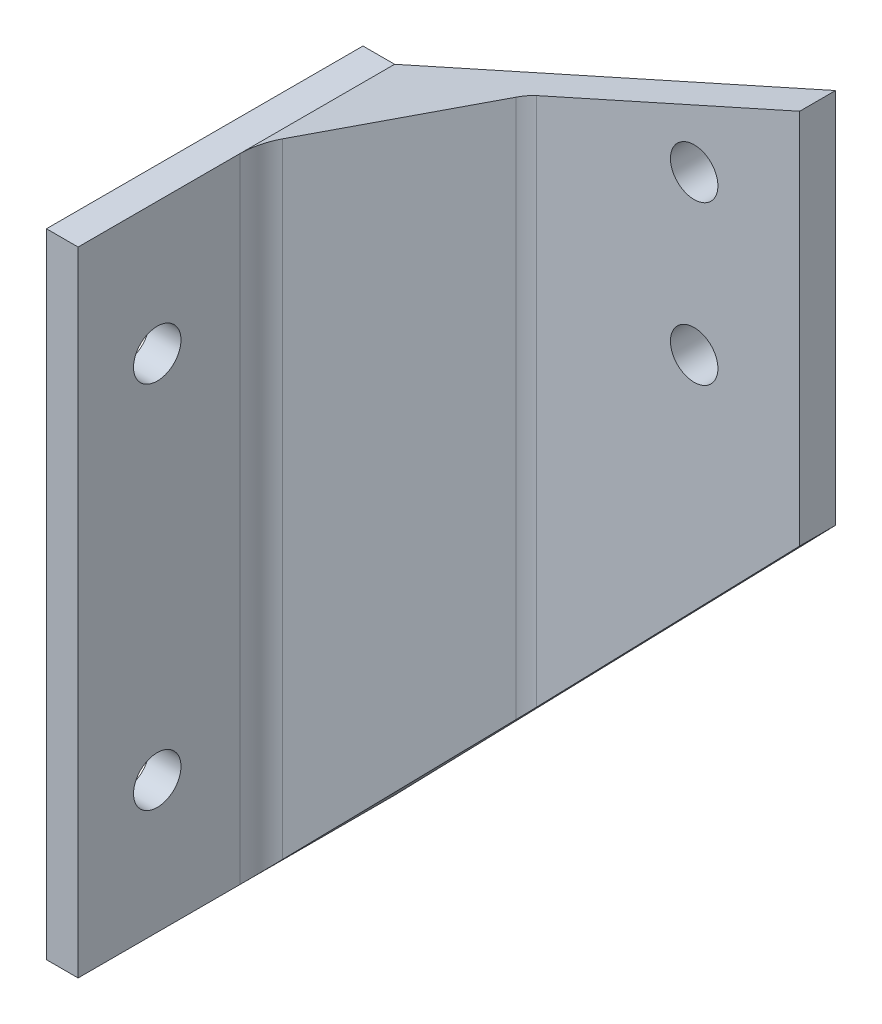
ISO-10303-21;
HEADER;
FILE_DESCRIPTION(('STEP AP214'),'2;1');
FILE_NAME('part.step','',(''),(''),'','','');
FILE_SCHEMA(('AUTOMOTIVE_DESIGN { 1 0 10303 214 1 1 1 1 }'));
ENDSEC;
DATA;
#1=APPLICATION_CONTEXT('core data for automotive mechanical design processes');
#2=APPLICATION_PROTOCOL_DEFINITION('international standard','automotive_design',2000,#1);
#3=PRODUCT_CONTEXT('',#1,'mechanical');
#4=PRODUCT('Part','Part','',(#3));
#5=PRODUCT_RELATED_PRODUCT_CATEGORY('part','',(#4));
#6=PRODUCT_DEFINITION_FORMATION('','',#4);
#7=PRODUCT_DEFINITION_CONTEXT('part definition',#1,'design');
#8=PRODUCT_DEFINITION('design','',#6,#7);
#9=PRODUCT_DEFINITION_SHAPE('','',#8);
#10=(LENGTH_UNIT() NAMED_UNIT(*) SI_UNIT(.MILLI.,.METRE.));
#11=(NAMED_UNIT(*) PLANE_ANGLE_UNIT() SI_UNIT($,.RADIAN.));
#12=(NAMED_UNIT(*) SI_UNIT($,.STERADIAN.) SOLID_ANGLE_UNIT());
#13=UNCERTAINTY_MEASURE_WITH_UNIT(LENGTH_MEASURE(1.E-05),#10,'distance_accuracy_value','');
#14=(GEOMETRIC_REPRESENTATION_CONTEXT(3) GLOBAL_UNCERTAINTY_ASSIGNED_CONTEXT((#13)) GLOBAL_UNIT_ASSIGNED_CONTEXT((#10,
#11,#12)) REPRESENTATION_CONTEXT('',''));
#15=CARTESIAN_POINT('',(0.,0.,0.));
#16=DIRECTION('',(0.,0.,1.));
#17=DIRECTION('',(1.,0.,0.));
#18=AXIS2_PLACEMENT_3D('',#15,#16,#17);
#19=CARTESIAN_POINT('',(3.,0.,0.));
#20=DIRECTION('',(-1.,0.,0.));
#21=DIRECTION('',(0.,0.,1.));
#22=AXIS2_PLACEMENT_3D('',#19,#20,#21);
#23=PLANE('',#22);
#24=CARTESIAN_POINT('',(3.,162.5,-37.5));
#25=DIRECTION('',(1.,0.,0.));
#26=DIRECTION('',(0.,0.,-1.));
#27=AXIS2_PLACEMENT_3D('',#24,#25,#26);
#28=CIRCLE('',#27,2.25);
#29=CARTESIAN_POINT('',(3.,162.5,-39.75));
#30=VERTEX_POINT('',#29);
#31=EDGE_CURVE('E218',#30,#30,#28,.T.);
#32=ORIENTED_EDGE('',*,*,#31,.F.);
#33=EDGE_LOOP('',(#32));
#34=FACE_BOUND('',#33,.T.);
#35=CARTESIAN_POINT('',(3.,127.5,-37.5));
#36=DIRECTION('',(1.,0.,0.));
#37=DIRECTION('',(0.,0.,-1.));
#38=AXIS2_PLACEMENT_3D('',#35,#36,#37);
#39=CIRCLE('',#38,2.25);
#40=CARTESIAN_POINT('',(3.,127.5,-39.75));
#41=VERTEX_POINT('',#40);
#42=EDGE_CURVE('E212',#41,#41,#39,.T.);
#43=ORIENTED_EDGE('',*,*,#42,.F.);
#44=EDGE_LOOP('',(#43));
#45=FACE_BOUND('',#44,.T.);
#46=DIRECTION('',(0.,0.,-1.));
#47=VECTOR('',#46,1.);
#48=CARTESIAN_POINT('',(3.,115.,-30.));
#49=LINE('',#48,#47);
#50=CARTESIAN_POINT('',(3.,115.,-30.));
#51=VERTEX_POINT('',#50);
#52=CARTESIAN_POINT('',(3.,115.,-45.3336084367677));
#53=VERTEX_POINT('',#52);
#54=EDGE_CURVE('E239',#51,#53,#49,.T.);
#55=ORIENTED_EDGE('',*,*,#54,.T.);
#56=DIRECTION('',(0.,-1.,0.));
#57=VECTOR('',#56,1.);
#58=CARTESIAN_POINT('',(3.,175.,-45.3336084367677));
#59=LINE('',#58,#57);
#60=CARTESIAN_POINT('',(3.,175.,-45.3336084367677));
#61=VERTEX_POINT('',#60);
#62=EDGE_CURVE('E300',#53,#61,#59,.F.);
#63=ORIENTED_EDGE('',*,*,#62,.T.);
#64=DIRECTION('',(0.,0.,1.));
#65=VECTOR('',#64,1.);
#66=CARTESIAN_POINT('',(3.,175.,-30.));
#67=LINE('',#66,#65);
#68=CARTESIAN_POINT('',(3.,175.,-30.));
#69=VERTEX_POINT('',#68);
#70=EDGE_CURVE('E230',#61,#69,#67,.T.);
#71=ORIENTED_EDGE('',*,*,#70,.T.);
#72=DIRECTION('',(0.,-1.,0.));
#73=VECTOR('',#72,1.);
#74=CARTESIAN_POINT('',(3.,115.,-30.));
#75=LINE('',#74,#73);
#76=EDGE_CURVE('E226',#69,#51,#75,.T.);
#77=ORIENTED_EDGE('',*,*,#76,.T.);
#78=EDGE_LOOP('',(#55,#63,#71,#77));
#79=FACE_BOUND('',#78,.T.);
#80=ADVANCED_FACE('F94',(#34,#45,#79),#23,.F.);
#81=CARTESIAN_POINT('',(0.,0.,-56.6));
#82=DIRECTION('',(0.,0.,1.));
#83=DIRECTION('',(1.,0.,0.));
#84=AXIS2_PLACEMENT_3D('',#81,#82,#83);
#85=PLANE('',#84);
#86=CARTESIAN_POINT('',(34.79,183.74,-56.6));
#87=DIRECTION('',(0.,0.,1.));
#88=DIRECTION('',(1.,0.,0.));
#89=AXIS2_PLACEMENT_3D('',#86,#87,#88);
#90=CIRCLE('',#89,2.25);
#91=CARTESIAN_POINT('',(37.04,183.74,-56.6));
#92=VERTEX_POINT('',#91);
#93=EDGE_CURVE('E277',#92,#92,#90,.T.);
#94=ORIENTED_EDGE('',*,*,#93,.F.);
#95=EDGE_LOOP('',(#94));
#96=FACE_BOUND('',#95,.T.);
#97=CARTESIAN_POINT('',(34.79,168.74,-56.6));
#98=DIRECTION('',(0.,0.,1.));
#99=DIRECTION('',(1.,0.,0.));
#100=AXIS2_PLACEMENT_3D('',#97,#98,#99);
#101=CIRCLE('',#100,2.25);
#102=CARTESIAN_POINT('',(37.04,168.74,-56.6));
#103=VERTEX_POINT('',#102);
#104=EDGE_CURVE('E281',#103,#103,#101,.T.);
#105=ORIENTED_EDGE('',*,*,#104,.F.);
#106=EDGE_LOOP('',(#105));
#107=FACE_BOUND('',#106,.T.);
#108=DIRECTION('',(-0.912455919956388,-0.409175016510713,0.));
#109=VECTOR('',#108,1.);
#110=CARTESIAN_POINT('',(44.79,193.74,-56.6));
#111=LINE('',#110,#109);
#112=CARTESIAN_POINT('',(44.79,193.74,-56.6));
#113=VERTEX_POINT('',#112);
#114=CARTESIAN_POINT('',(19.8548036683782,182.558244095368,-56.6));
#115=VERTEX_POINT('',#114);
#116=EDGE_CURVE('E209',#113,#115,#111,.T.);
#117=ORIENTED_EDGE('',*,*,#116,.T.);
#118=DIRECTION('',(0.,-1.,0.));
#119=VECTOR('',#118,1.);
#120=CARTESIAN_POINT('',(19.8548036683783,0.,-56.6));
#121=LINE('',#120,#119);
#122=CARTESIAN_POINT('',(19.8548036683782,132.36436303383,-56.6));
#123=VERTEX_POINT('',#122);
#124=EDGE_CURVE('E184',#115,#123,#121,.T.);
#125=ORIENTED_EDGE('',*,*,#124,.T.);
#126=DIRECTION('',(-0.6965,-0.717556792177455,0.));
#127=VECTOR('',#126,1.);
#128=CARTESIAN_POINT('',(3.,115.,-56.6));
#129=LINE('',#128,#127);
#130=CARTESIAN_POINT('',(44.79,158.053407530647,-56.6));
#131=VERTEX_POINT('',#130);
#132=EDGE_CURVE('E170',#131,#123,#129,.T.);
#133=ORIENTED_EDGE('',*,*,#132,.F.);
#134=DIRECTION('',(0.,1.,0.));
#135=VECTOR('',#134,1.);
#136=CARTESIAN_POINT('',(44.79,115.,-56.6));
#137=LINE('',#136,#135);
#138=EDGE_CURVE('E181',#131,#113,#137,.T.);
#139=ORIENTED_EDGE('',*,*,#138,.T.);
#140=EDGE_LOOP('',(#117,#125,#133,#139));
#141=FACE_BOUND('',#140,.T.);
#142=ADVANCED_FACE('F180',(#96,#107,#141),#85,.T.);
#143=CARTESIAN_POINT('',(0.,0.,0.));
#144=DIRECTION('',(-1.,0.,0.));
#145=DIRECTION('',(0.,0.,1.));
#146=AXIS2_PLACEMENT_3D('',#143,#144,#145);
#147=PLANE('',#146);
#148=CARTESIAN_POINT('',(0.,162.5,-37.5));
#149=DIRECTION('',(1.,0.,0.));
#150=DIRECTION('',(0.,0.,-1.));
#151=AXIS2_PLACEMENT_3D('',#148,#149,#150);
#152=CIRCLE('',#151,2.25);
#153=CARTESIAN_POINT('',(0.,162.5,-39.75));
#154=VERTEX_POINT('',#153);
#155=EDGE_CURVE('E215',#154,#154,#152,.T.);
#156=ORIENTED_EDGE('',*,*,#155,.T.);
#157=EDGE_LOOP('',(#156));
#158=FACE_BOUND('',#157,.T.);
#159=DIRECTION('',(0.,1.,0.));
#160=VECTOR('',#159,1.);
#161=CARTESIAN_POINT('',(0.,115.,-60.));
#162=LINE('',#161,#160);
#163=CARTESIAN_POINT('',(0.,115.,-60.));
#164=VERTEX_POINT('',#163);
#165=CARTESIAN_POINT('',(0.,175.,-60.));
#166=VERTEX_POINT('',#165);
#167=EDGE_CURVE('E221',#164,#166,#162,.T.);
#168=ORIENTED_EDGE('',*,*,#167,.F.);
#169=DIRECTION('',(0.,0.,-1.));
#170=VECTOR('',#169,1.);
#171=CARTESIAN_POINT('',(0.,115.,-30.));
#172=LINE('',#171,#170);
#173=CARTESIAN_POINT('',(0.,115.,-30.));
#174=VERTEX_POINT('',#173);
#175=EDGE_CURVE('E251',#174,#164,#172,.T.);
#176=ORIENTED_EDGE('',*,*,#175,.F.);
#177=DIRECTION('',(0.,-1.,0.));
#178=VECTOR('',#177,1.);
#179=CARTESIAN_POINT('',(0.,115.,-30.));
#180=LINE('',#179,#178);
#181=CARTESIAN_POINT('',(0.,175.,-30.));
#182=VERTEX_POINT('',#181);
#183=EDGE_CURVE('E249',#182,#174,#180,.T.);
#184=ORIENTED_EDGE('',*,*,#183,.F.);
#185=DIRECTION('',(0.,0.,1.));
#186=VECTOR('',#185,1.);
#187=CARTESIAN_POINT('',(0.,175.,-30.));
#188=LINE('',#187,#186);
#189=EDGE_CURVE('E247',#166,#182,#188,.T.);
#190=ORIENTED_EDGE('',*,*,#189,.F.);
#191=EDGE_LOOP('',(#168,#176,#184,#190));
#192=FACE_BOUND('',#191,.T.);
#193=CARTESIAN_POINT('',(0.,127.5,-37.5));
#194=DIRECTION('',(1.,0.,0.));
#195=DIRECTION('',(0.,0.,-1.));
#196=AXIS2_PLACEMENT_3D('',#193,#194,#195);
#197=CIRCLE('',#196,2.25);
#198=CARTESIAN_POINT('',(0.,127.5,-39.75));
#199=VERTEX_POINT('',#198);
#200=EDGE_CURVE('E194',#199,#199,#197,.T.);
#201=ORIENTED_EDGE('',*,*,#200,.T.);
#202=EDGE_LOOP('',(#201));
#203=FACE_BOUND('',#202,.T.);
#204=ADVANCED_FACE('F340',(#158,#192,#203),#147,.T.);
#205=CARTESIAN_POINT('',(3.,115.,-60.));
#206=DIRECTION('',(0.,0.,1.));
#207=DIRECTION('',(1.,0.,0.));
#208=AXIS2_PLACEMENT_3D('',#205,#206,#207);
#209=PLANE('',#208);
#210=CARTESIAN_POINT('',(34.79,183.74,-60.));
#211=DIRECTION('',(0.,0.,1.));
#212=DIRECTION('',(1.,0.,0.));
#213=AXIS2_PLACEMENT_3D('',#210,#211,#212);
#214=CIRCLE('',#213,2.25);
#215=CARTESIAN_POINT('',(37.04,183.74,-60.));
#216=VERTEX_POINT('',#215);
#217=EDGE_CURVE('E280',#216,#216,#214,.F.);
#218=ORIENTED_EDGE('',*,*,#217,.F.);
#219=EDGE_LOOP('',(#218));
#220=FACE_BOUND('',#219,.T.);
#221=CARTESIAN_POINT('',(34.79,168.74,-60.));
#222=DIRECTION('',(0.,0.,1.));
#223=DIRECTION('',(1.,0.,0.));
#224=AXIS2_PLACEMENT_3D('',#221,#222,#223);
#225=CIRCLE('',#224,2.25);
#226=CARTESIAN_POINT('',(37.04,168.74,-60.));
#227=VERTEX_POINT('',#226);
#228=EDGE_CURVE('E275',#227,#227,#225,.F.);
#229=ORIENTED_EDGE('',*,*,#228,.F.);
#230=EDGE_LOOP('',(#229));
#231=FACE_BOUND('',#230,.T.);
#232=DIRECTION('',(0.,1.,0.));
#233=VECTOR('',#232,1.);
#234=CARTESIAN_POINT('',(44.79,115.,-60.));
#235=LINE('',#234,#233);
#236=CARTESIAN_POINT('',(44.79,158.053407530647,-60.));
#237=VERTEX_POINT('',#236);
#238=CARTESIAN_POINT('',(44.79,193.74,-60.));
#239=VERTEX_POINT('',#238);
#240=EDGE_CURVE('E191',#237,#239,#235,.T.);
#241=ORIENTED_EDGE('',*,*,#240,.F.);
#242=DIRECTION('',(0.6965,0.717556792177455,0.));
#243=VECTOR('',#242,1.);
#244=CARTESIAN_POINT('',(3.,115.,-60.));
#245=LINE('',#244,#243);
#246=CARTESIAN_POINT('',(3.,115.,-60.));
#247=VERTEX_POINT('',#246);
#248=EDGE_CURVE('E172',#247,#237,#245,.T.);
#249=ORIENTED_EDGE('',*,*,#248,.F.);
#250=DIRECTION('',(-1.,0.,0.));
#251=VECTOR('',#250,1.);
#252=CARTESIAN_POINT('',(3.,115.,-60.));
#253=LINE('',#252,#251);
#254=EDGE_CURVE('E241',#247,#164,#253,.T.);
#255=ORIENTED_EDGE('',*,*,#254,.T.);
#256=ORIENTED_EDGE('',*,*,#167,.T.);
#257=DIRECTION('',(-1.,0.,0.));
#258=VECTOR('',#257,1.);
#259=CARTESIAN_POINT('',(3.,175.,-60.));
#260=LINE('',#259,#258);
#261=CARTESIAN_POINT('',(3.,175.,-60.));
#262=VERTEX_POINT('',#261);
#263=EDGE_CURVE('E242',#262,#166,#260,.T.);
#264=ORIENTED_EDGE('',*,*,#263,.F.);
#265=DIRECTION('',(-0.912455919956388,-0.409175016510713,0.));
#266=VECTOR('',#265,1.);
#267=CARTESIAN_POINT('',(44.79,193.74,-60.));
#268=LINE('',#267,#266);
#269=EDGE_CURVE('E192',#239,#262,#268,.T.);
#270=ORIENTED_EDGE('',*,*,#269,.F.);
#271=EDGE_LOOP('',(#241,#249,#255,#256,#264,#270));
#272=FACE_BOUND('',#271,.T.);
#273=ADVANCED_FACE('F347',(#220,#231,#272),#209,.F.);
#274=CARTESIAN_POINT('',(3.,175.,-30.));
#275=DIRECTION('',(0.,-1.,0.));
#276=DIRECTION('',(0.,0.,-1.));
#277=AXIS2_PLACEMENT_3D('',#274,#275,#276);
#278=PLANE('',#277);
#279=ORIENTED_EDGE('',*,*,#189,.T.);
#280=DIRECTION('',(-1.,0.,0.));
#281=VECTOR('',#280,1.);
#282=CARTESIAN_POINT('',(3.,175.,-30.));
#283=LINE('',#282,#281);
#284=EDGE_CURVE('E237',#69,#182,#283,.T.);
#285=ORIENTED_EDGE('',*,*,#284,.F.);
#286=ORIENTED_EDGE('',*,*,#70,.F.);
#287=EDGE_CURVE('E234',#262,#61,#67,.T.);
#288=ORIENTED_EDGE('',*,*,#287,.F.);
#289=ORIENTED_EDGE('',*,*,#263,.T.);
#290=EDGE_LOOP('',(#279,#285,#286,#288,#289));
#291=FACE_BOUND('',#290,.T.);
#292=ADVANCED_FACE('F314',(#291),#278,.F.);
#293=CARTESIAN_POINT('',(3.,115.,-30.));
#294=DIRECTION('',(0.,0.,-1.));
#295=DIRECTION('',(-1.,0.,0.));
#296=AXIS2_PLACEMENT_3D('',#293,#294,#295);
#297=PLANE('',#296);
#298=ORIENTED_EDGE('',*,*,#183,.T.);
#299=DIRECTION('',(-1.,0.,0.));
#300=VECTOR('',#299,1.);
#301=CARTESIAN_POINT('',(3.,115.,-30.));
#302=LINE('',#301,#300);
#303=EDGE_CURVE('E253',#51,#174,#302,.T.);
#304=ORIENTED_EDGE('',*,*,#303,.F.);
#305=ORIENTED_EDGE('',*,*,#76,.F.);
#306=ORIENTED_EDGE('',*,*,#284,.T.);
#307=EDGE_LOOP('',(#298,#304,#305,#306));
#308=FACE_BOUND('',#307,.T.);
#309=ADVANCED_FACE('F320',(#308),#297,.F.);
#310=CARTESIAN_POINT('',(3.,115.,-30.));
#311=DIRECTION('',(0.,1.,0.));
#312=DIRECTION('',(0.,0.,1.));
#313=AXIS2_PLACEMENT_3D('',#310,#311,#312);
#314=PLANE('',#313);
#315=ORIENTED_EDGE('',*,*,#254,.F.);
#316=DIRECTION('',(0.,0.,1.));
#317=VECTOR('',#316,1.);
#318=CARTESIAN_POINT('',(3.,115.,-120.));
#319=LINE('',#318,#317);
#320=EDGE_CURVE('E109',#247,#53,#319,.T.);
#321=ORIENTED_EDGE('',*,*,#320,.T.);
#322=ORIENTED_EDGE('',*,*,#54,.F.);
#323=ORIENTED_EDGE('',*,*,#303,.T.);
#324=ORIENTED_EDGE('',*,*,#175,.T.);
#325=EDGE_LOOP('',(#315,#321,#322,#323,#324));
#326=FACE_BOUND('',#325,.T.);
#327=ADVANCED_FACE('F321',(#326),#314,.F.);
#328=CARTESIAN_POINT('',(3.,162.5,-37.5));
#329=DIRECTION('',(-1.,0.,0.));
#330=DIRECTION('',(0.,0.,1.));
#331=AXIS2_PLACEMENT_3D('',#328,#329,#330);
#332=CYLINDRICAL_SURFACE('',#331,2.25);
#333=ORIENTED_EDGE('',*,*,#31,.T.);
#334=EDGE_LOOP('',(#333));
#335=FACE_BOUND('',#334,.T.);
#336=ORIENTED_EDGE('',*,*,#155,.F.);
#337=EDGE_LOOP('',(#336));
#338=FACE_BOUND('',#337,.T.);
#339=ADVANCED_FACE('F323',(#335,#338),#332,.F.);
#340=CARTESIAN_POINT('',(3.,127.5,-37.5));
#341=DIRECTION('',(-1.,0.,0.));
#342=DIRECTION('',(0.,0.,1.));
#343=AXIS2_PLACEMENT_3D('',#340,#341,#342);
#344=CYLINDRICAL_SURFACE('',#343,2.25);
#345=ORIENTED_EDGE('',*,*,#42,.T.);
#346=EDGE_LOOP('',(#345));
#347=FACE_BOUND('',#346,.T.);
#348=ORIENTED_EDGE('',*,*,#200,.F.);
#349=EDGE_LOOP('',(#348));
#350=FACE_BOUND('',#349,.T.);
#351=ADVANCED_FACE('F329',(#347,#350),#344,.F.);
#352=CARTESIAN_POINT('',(44.79,193.74,-60.));
#353=DIRECTION('',(-0.409175016510713,0.912455919956388,0.));
#354=DIRECTION('',(-0.912455919956388,-0.409175016510713,0.));
#355=AXIS2_PLACEMENT_3D('',#352,#353,#354);
#356=PLANE('',#355);
#357=ORIENTED_EDGE('',*,*,#116,.F.);
#358=DIRECTION('',(0.,0.,1.));
#359=VECTOR('',#358,1.);
#360=CARTESIAN_POINT('',(44.79,193.74,-60.));
#361=LINE('',#360,#359);
#362=EDGE_CURVE('E189',#239,#113,#361,.T.);
#363=ORIENTED_EDGE('',*,*,#362,.F.);
#364=ORIENTED_EDGE('',*,*,#269,.T.);
#365=ORIENTED_EDGE('',*,*,#287,.T.);
#366=CARTESIAN_POINT('',(6.,176.345297918162,-45.3336084367677));
#367=DIRECTION('',(-0.409175016510713,0.912455919956388,0.));
#368=DIRECTION('',(0.912455919956388,0.409175016510713,0.));
#369=AXIS2_PLACEMENT_3D('',#366,#367,#368);
#370=ELLIPSE('',#369,3.28783005774502,3.);
#371=CARTESIAN_POINT('',(4.46287397573009,175.656000438028,-47.9098932784558));
#372=VERTEX_POINT('',#371);
#373=EDGE_CURVE('E12',#61,#372,#370,.F.);
#374=ORIENTED_EDGE('',*,*,#373,.T.);
#375=DIRECTION('',(0.801392061831442,0.359370357471196,-0.478146117211649));
#376=VECTOR('',#375,1.);
#377=CARTESIAN_POINT('',(3.,175.,-47.037077655767));
#378=LINE('',#377,#376);
#379=CARTESIAN_POINT('',(18.3176776441084,181.868946615233,-56.1762848416881));
#380=VERTEX_POINT('',#379);
#381=EDGE_CURVE('E267',#372,#380,#378,.T.);
#382=ORIENTED_EDGE('',*,*,#381,.T.);
#383=CARTESIAN_POINT('',(19.8548036683783,182.558244095368,-53.6));
#384=DIRECTION('',(-0.409175016510713,0.912455919956388,0.));
#385=DIRECTION('',(-0.912455919956388,-0.409175016510713,0.));
#386=AXIS2_PLACEMENT_3D('',#383,#384,#385);
#387=ELLIPSE('',#386,3.28783005774502,3.);
#388=EDGE_CURVE('E296',#380,#115,#387,.F.);
#389=ORIENTED_EDGE('',*,*,#388,.T.);
#390=EDGE_LOOP('',(#357,#363,#364,#365,#374,#382,#389));
#391=FACE_BOUND('',#390,.T.);
#392=ADVANCED_FACE('F361',(#391),#356,.T.);
#393=CARTESIAN_POINT('',(44.79,115.,-60.));
#394=DIRECTION('',(1.,0.,0.));
#395=DIRECTION('',(0.,0.,-1.));
#396=AXIS2_PLACEMENT_3D('',#393,#394,#395);
#397=PLANE('',#396);
#398=DIRECTION('',(0.,0.,1.));
#399=VECTOR('',#398,1.);
#400=CARTESIAN_POINT('',(44.79,158.053407530647,-120.));
#401=LINE('',#400,#399);
#402=EDGE_CURVE('E167',#237,#131,#401,.T.);
#403=ORIENTED_EDGE('',*,*,#402,.F.);
#404=ORIENTED_EDGE('',*,*,#240,.T.);
#405=ORIENTED_EDGE('',*,*,#362,.T.);
#406=ORIENTED_EDGE('',*,*,#138,.F.);
#407=EDGE_LOOP('',(#403,#404,#405,#406));
#408=FACE_BOUND('',#407,.T.);
#409=ADVANCED_FACE('F187',(#408),#397,.T.);
#410=CARTESIAN_POINT('',(34.79,168.74,-66.3639610306789));
#411=DIRECTION('',(0.,0.,1.));
#412=DIRECTION('',(1.,0.,0.));
#413=AXIS2_PLACEMENT_3D('',#410,#411,#412);
#414=CYLINDRICAL_SURFACE('',#413,2.25);
#415=ORIENTED_EDGE('',*,*,#228,.T.);
#416=EDGE_LOOP('',(#415));
#417=FACE_BOUND('',#416,.T.);
#418=ORIENTED_EDGE('',*,*,#104,.T.);
#419=EDGE_LOOP('',(#418));
#420=FACE_BOUND('',#419,.T.);
#421=ADVANCED_FACE('F367',(#417,#420),#414,.F.);
#422=CARTESIAN_POINT('',(34.79,183.74,-66.3639610306789));
#423=DIRECTION('',(0.,0.,1.));
#424=DIRECTION('',(1.,0.,0.));
#425=AXIS2_PLACEMENT_3D('',#422,#423,#424);
#426=CYLINDRICAL_SURFACE('',#425,2.25);
#427=ORIENTED_EDGE('',*,*,#217,.T.);
#428=EDGE_LOOP('',(#427));
#429=FACE_BOUND('',#428,.T.);
#430=ORIENTED_EDGE('',*,*,#93,.T.);
#431=EDGE_LOOP('',(#430));
#432=FACE_BOUND('',#431,.T.);
#433=ADVANCED_FACE('F373',(#429,#432),#426,.F.);
#434=CARTESIAN_POINT('',(3.,115.,-120.));
#435=DIRECTION('',(-0.717556792177455,0.6965,0.));
#436=DIRECTION('',(-0.6965,-0.717556792177455,0.));
#437=AXIS2_PLACEMENT_3D('',#434,#435,#436);
#438=PLANE('',#437);
#439=ORIENTED_EDGE('',*,*,#248,.T.);
#440=ORIENTED_EDGE('',*,*,#402,.T.);
#441=ORIENTED_EDGE('',*,*,#132,.T.);
#442=CARTESIAN_POINT('',(19.8548036683783,132.36436303383,-53.6));
#443=DIRECTION('',(-0.717556792177455,0.6965,0.));
#444=DIRECTION('',(-0.6965,-0.717556792177455,0.));
#445=AXIS2_PLACEMENT_3D('',#442,#443,#444);
#446=ELLIPSE('',#445,4.30725053840632,3.);
#447=CARTESIAN_POINT('',(18.3176776441084,130.780766164989,-56.1762848416881));
#448=VERTEX_POINT('',#447);
#449=EDGE_CURVE('E297',#123,#448,#446,.T.);
#450=ORIENTED_EDGE('',*,*,#449,.T.);
#451=DIRECTION('',(0.643174844151758,0.662619494585456,-0.383746694116935));
#452=VECTOR('',#451,1.);
#453=CARTESIAN_POINT('',(28.570811409715,141.343875676281,-62.2937600860432));
#454=LINE('',#453,#452);
#455=CARTESIAN_POINT('',(4.4628739757301,116.507100010603,-47.9098932784558));
#456=VERTEX_POINT('',#455);
#457=EDGE_CURVE('E185',#456,#448,#454,.T.);
#458=ORIENTED_EDGE('',*,*,#457,.F.);
#459=CARTESIAN_POINT('',(6.,118.090696879443,-45.3336084367677));
#460=DIRECTION('',(-0.717556792177455,0.6965,0.));
#461=DIRECTION('',(0.6965,0.717556792177455,0.));
#462=AXIS2_PLACEMENT_3D('',#459,#460,#461);
#463=ELLIPSE('',#462,4.30725053840632,3.);
#464=EDGE_CURVE('E103',#456,#53,#463,.T.);
#465=ORIENTED_EDGE('',*,*,#464,.T.);
#466=ORIENTED_EDGE('',*,*,#320,.F.);
#467=EDGE_LOOP('',(#439,#440,#441,#450,#458,#465,#466));
#468=FACE_BOUND('',#467,.T.);
#469=ADVANCED_FACE('F169',(#468),#438,.F.);
#470=CARTESIAN_POINT('',(3.,175.,-47.037077655767));
#471=DIRECTION('',(-0.5123753414233,0.,-0.858761613896055));
#472=DIRECTION('',(-0.858761613896055,0.,0.5123753414233));
#473=AXIS2_PLACEMENT_3D('',#470,#471,#472);
#474=PLANE('',#473);
#475=ORIENTED_EDGE('',*,*,#457,.T.);
#476=DIRECTION('',(0.,-1.,0.));
#477=VECTOR('',#476,1.);
#478=CARTESIAN_POINT('',(18.3176776441084,175.,-56.1762848416881));
#479=LINE('',#478,#477);
#480=EDGE_CURVE('E298',#448,#380,#479,.F.);
#481=ORIENTED_EDGE('',*,*,#480,.T.);
#482=ORIENTED_EDGE('',*,*,#381,.F.);
#483=DIRECTION('',(0.,-1.,0.));
#484=VECTOR('',#483,1.);
#485=CARTESIAN_POINT('',(4.4628739757301,115.,-47.9098932784558));
#486=LINE('',#485,#484);
#487=EDGE_CURVE('E266',#372,#456,#486,.T.);
#488=ORIENTED_EDGE('',*,*,#487,.T.);
#489=EDGE_LOOP('',(#475,#481,#482,#488));
#490=FACE_BOUND('',#489,.T.);
#491=ADVANCED_FACE('F382',(#490),#474,.F.);
#492=CARTESIAN_POINT('',(19.8548036683783,0.,-53.6));
#493=DIRECTION('',(0.,-1.,0.));
#494=DIRECTION('',(0.,0.,-1.));
#495=AXIS2_PLACEMENT_3D('',#492,#493,#494);
#496=CYLINDRICAL_SURFACE('',#495,3.);
#497=ORIENTED_EDGE('',*,*,#388,.F.);
#498=ORIENTED_EDGE('',*,*,#480,.F.);
#499=ORIENTED_EDGE('',*,*,#449,.F.);
#500=ORIENTED_EDGE('',*,*,#124,.F.);
#501=EDGE_LOOP('',(#497,#498,#499,#500));
#502=FACE_BOUND('',#501,.T.);
#503=ADVANCED_FACE('F294',(#502),#496,.F.);
#504=CARTESIAN_POINT('',(6.,175.,-45.3336084367677));
#505=DIRECTION('',(0.,1.,0.));
#506=DIRECTION('',(0.,0.,1.));
#507=AXIS2_PLACEMENT_3D('',#504,#505,#506);
#508=CYLINDRICAL_SURFACE('',#507,3.);
#509=ORIENTED_EDGE('',*,*,#373,.F.);
#510=ORIENTED_EDGE('',*,*,#62,.F.);
#511=ORIENTED_EDGE('',*,*,#464,.F.);
#512=ORIENTED_EDGE('',*,*,#487,.F.);
#513=EDGE_LOOP('',(#509,#510,#511,#512));
#514=FACE_BOUND('',#513,.T.);
#515=ADVANCED_FACE('F96',(#514),#508,.F.);
#516=CLOSED_SHELL('',(#80,#142,#204,#273,#292,#309,#327,#339,#351,#392,#409,#421,#433,#469,#491,
#503,#515));
#517=MANIFOLD_SOLID_BREP('B2',#516);
#518=ADVANCED_BREP_SHAPE_REPRESENTATION('',(#18,#517),#14);
#519=SHAPE_DEFINITION_REPRESENTATION(#9,#518);
ENDSEC;
END-ISO-10303-21;
